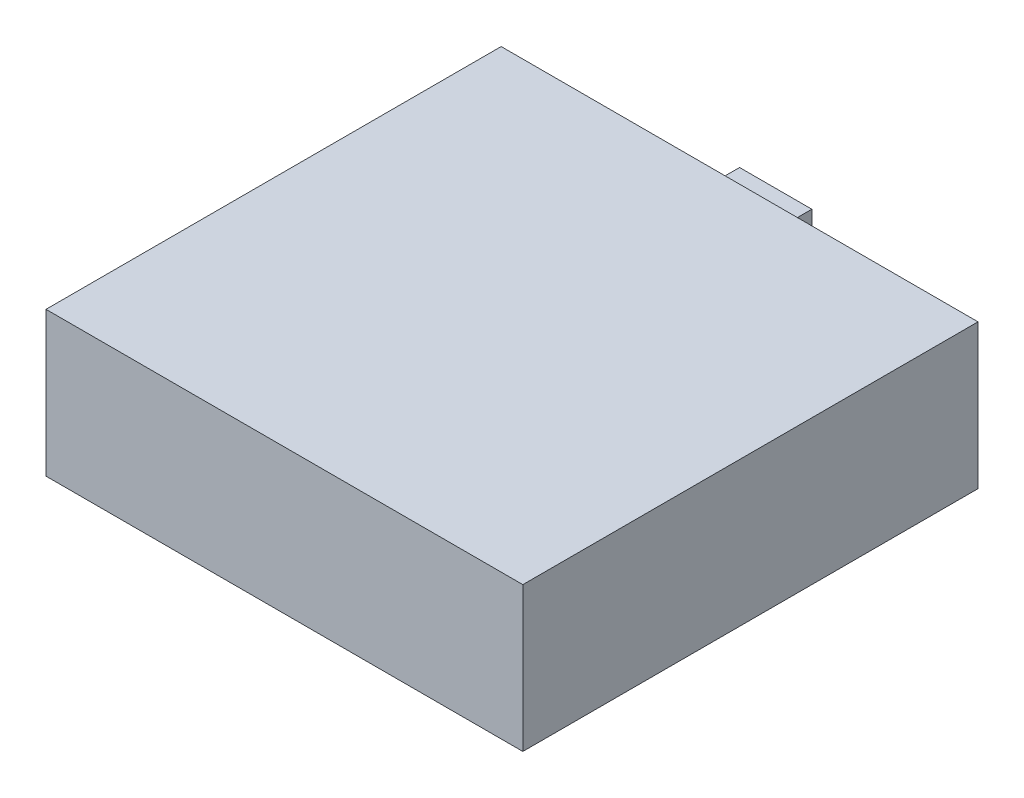
ISO-10303-21;
HEADER;
FILE_DESCRIPTION(('STEP AP214'),'2;1');
FILE_NAME('part.step','',(''),(''),'','','');
FILE_SCHEMA(('AUTOMOTIVE_DESIGN { 1 0 10303 214 1 1 1 1 }'));
ENDSEC;
DATA;
#1=APPLICATION_CONTEXT('core data for automotive mechanical design processes');
#2=APPLICATION_PROTOCOL_DEFINITION('international standard','automotive_design',2000,#1);
#3=PRODUCT_CONTEXT('',#1,'mechanical');
#4=PRODUCT('Part','Part','',(#3));
#5=PRODUCT_RELATED_PRODUCT_CATEGORY('part','',(#4));
#6=PRODUCT_DEFINITION_FORMATION('','',#4);
#7=PRODUCT_DEFINITION_CONTEXT('part definition',#1,'design');
#8=PRODUCT_DEFINITION('design','',#6,#7);
#9=PRODUCT_DEFINITION_SHAPE('','',#8);
#10=(LENGTH_UNIT() NAMED_UNIT(*) SI_UNIT(.MILLI.,.METRE.));
#11=(NAMED_UNIT(*) PLANE_ANGLE_UNIT() SI_UNIT($,.RADIAN.));
#12=(NAMED_UNIT(*) SI_UNIT($,.STERADIAN.) SOLID_ANGLE_UNIT());
#13=UNCERTAINTY_MEASURE_WITH_UNIT(LENGTH_MEASURE(1.E-05),#10,'distance_accuracy_value','');
#14=(GEOMETRIC_REPRESENTATION_CONTEXT(3) GLOBAL_UNCERTAINTY_ASSIGNED_CONTEXT((#13)) GLOBAL_UNIT_ASSIGNED_CONTEXT((#10,
#11,#12)) REPRESENTATION_CONTEXT('',''));
#15=CARTESIAN_POINT('',(0.,0.,0.));
#16=DIRECTION('',(0.,0.,1.));
#17=DIRECTION('',(1.,0.,0.));
#18=AXIS2_PLACEMENT_3D('',#15,#16,#17);
#19=CARTESIAN_POINT('',(-33.,20.,-31.5));
#20=DIRECTION('',(0.,0.,1.));
#21=DIRECTION('',(1.,0.,0.));
#22=AXIS2_PLACEMENT_3D('',#19,#20,#21);
#23=PLANE('',#22);
#24=DIRECTION('',(-1.,0.,0.));
#25=VECTOR('',#24,1.);
#26=CARTESIAN_POINT('',(-33.,0.,-31.5));
#27=LINE('',#26,#25);
#28=CARTESIAN_POINT('',(33.,0.,-31.5));
#29=VERTEX_POINT('',#28);
#30=CARTESIAN_POINT('',(-33.,0.,-31.5));
#31=VERTEX_POINT('',#30);
#32=EDGE_CURVE('E144',#29,#31,#27,.T.);
#33=ORIENTED_EDGE('',*,*,#32,.T.);
#34=DIRECTION('',(0.,-1.,0.));
#35=VECTOR('',#34,1.);
#36=CARTESIAN_POINT('',(-33.,20.,-31.5));
#37=LINE('',#36,#35);
#38=CARTESIAN_POINT('',(-33.,20.,-31.5));
#39=VERTEX_POINT('',#38);
#40=EDGE_CURVE('E58',#39,#31,#37,.T.);
#41=ORIENTED_EDGE('',*,*,#40,.F.);
#42=DIRECTION('',(-1.,0.,0.));
#43=VECTOR('',#42,1.);
#44=CARTESIAN_POINT('',(-33.,20.,-31.5));
#45=LINE('',#44,#43);
#46=CARTESIAN_POINT('',(33.,20.,-31.5));
#47=VERTEX_POINT('',#46);
#48=EDGE_CURVE('E154',#47,#39,#45,.T.);
#49=ORIENTED_EDGE('',*,*,#48,.F.);
#50=DIRECTION('',(0.,-1.,0.));
#51=VECTOR('',#50,1.);
#52=CARTESIAN_POINT('',(33.,20.,-31.5));
#53=LINE('',#52,#51);
#54=EDGE_CURVE('E11',#47,#29,#53,.T.);
#55=ORIENTED_EDGE('',*,*,#54,.T.);
#56=EDGE_LOOP('',(#33,#41,#49,#55));
#57=FACE_BOUND('',#56,.T.);
#58=DIRECTION('',(0.,1.,0.));
#59=VECTOR('',#58,1.);
#60=CARTESIAN_POINT('',(-5.,17.,-31.5));
#61=LINE('',#60,#59);
#62=CARTESIAN_POINT('',(-5.,13.,-31.5));
#63=VERTEX_POINT('',#62);
#64=CARTESIAN_POINT('',(-4.99999999999999,17.,-31.5));
#65=VERTEX_POINT('',#64);
#66=EDGE_CURVE('E137',#63,#65,#61,.T.);
#67=ORIENTED_EDGE('',*,*,#66,.F.);
#68=DIRECTION('',(-1.,0.,0.));
#69=VECTOR('',#68,1.);
#70=CARTESIAN_POINT('',(5.,13.,-31.5));
#71=LINE('',#70,#69);
#72=CARTESIAN_POINT('',(5.,13.,-31.5));
#73=VERTEX_POINT('',#72);
#74=EDGE_CURVE('E134',#73,#63,#71,.T.);
#75=ORIENTED_EDGE('',*,*,#74,.F.);
#76=DIRECTION('',(0.,-1.,0.));
#77=VECTOR('',#76,1.);
#78=CARTESIAN_POINT('',(5.,17.,-31.5));
#79=LINE('',#78,#77);
#80=CARTESIAN_POINT('',(5.,17.,-31.5));
#81=VERTEX_POINT('',#80);
#82=EDGE_CURVE('E70',#81,#73,#79,.T.);
#83=ORIENTED_EDGE('',*,*,#82,.F.);
#84=DIRECTION('',(1.,0.,0.));
#85=VECTOR('',#84,1.);
#86=CARTESIAN_POINT('',(5.,17.,-31.5));
#87=LINE('',#86,#85);
#88=EDGE_CURVE('E65',#65,#81,#87,.T.);
#89=ORIENTED_EDGE('',*,*,#88,.F.);
#90=EDGE_LOOP('',(#67,#75,#83,#89));
#91=FACE_BOUND('',#90,.T.);
#92=ADVANCED_FACE('F49',(#57,#91),#23,.F.);
#93=CARTESIAN_POINT('',(33.,20.,-31.5));
#94=DIRECTION('',(-1.,0.,0.));
#95=DIRECTION('',(0.,0.,1.));
#96=AXIS2_PLACEMENT_3D('',#93,#94,#95);
#97=PLANE('',#96);
#98=DIRECTION('',(0.,0.,-1.));
#99=VECTOR('',#98,1.);
#100=CARTESIAN_POINT('',(33.,0.,-31.5));
#101=LINE('',#100,#99);
#102=CARTESIAN_POINT('',(33.,0.,31.5));
#103=VERTEX_POINT('',#102);
#104=EDGE_CURVE('E139',#103,#29,#101,.T.);
#105=ORIENTED_EDGE('',*,*,#104,.T.);
#106=ORIENTED_EDGE('',*,*,#54,.F.);
#107=DIRECTION('',(0.,0.,-1.));
#108=VECTOR('',#107,1.);
#109=CARTESIAN_POINT('',(33.,20.,-31.5));
#110=LINE('',#109,#108);
#111=CARTESIAN_POINT('',(33.,20.,31.5));
#112=VERTEX_POINT('',#111);
#113=EDGE_CURVE('E150',#112,#47,#110,.T.);
#114=ORIENTED_EDGE('',*,*,#113,.F.);
#115=DIRECTION('',(0.,-1.,0.));
#116=VECTOR('',#115,1.);
#117=CARTESIAN_POINT('',(33.,20.,31.5));
#118=LINE('',#117,#116);
#119=EDGE_CURVE('E163',#112,#103,#118,.T.);
#120=ORIENTED_EDGE('',*,*,#119,.T.);
#121=EDGE_LOOP('',(#105,#106,#114,#120));
#122=FACE_BOUND('',#121,.T.);
#123=ADVANCED_FACE('F51',(#122),#97,.F.);
#124=CARTESIAN_POINT('',(-33.,20.,-31.5));
#125=DIRECTION('',(1.,0.,0.));
#126=DIRECTION('',(0.,0.,-1.));
#127=AXIS2_PLACEMENT_3D('',#124,#125,#126);
#128=PLANE('',#127);
#129=DIRECTION('',(0.,0.,1.));
#130=VECTOR('',#129,1.);
#131=CARTESIAN_POINT('',(-33.,0.,-31.5));
#132=LINE('',#131,#130);
#133=CARTESIAN_POINT('',(-33.,0.,31.5));
#134=VERTEX_POINT('',#133);
#135=EDGE_CURVE('E167',#31,#134,#132,.T.);
#136=ORIENTED_EDGE('',*,*,#135,.T.);
#137=DIRECTION('',(0.,-1.,0.));
#138=VECTOR('',#137,1.);
#139=CARTESIAN_POINT('',(-33.,20.,31.5));
#140=LINE('',#139,#138);
#141=CARTESIAN_POINT('',(-33.,20.,31.5));
#142=VERTEX_POINT('',#141);
#143=EDGE_CURVE('E175',#142,#134,#140,.T.);
#144=ORIENTED_EDGE('',*,*,#143,.F.);
#145=DIRECTION('',(0.,0.,1.));
#146=VECTOR('',#145,1.);
#147=CARTESIAN_POINT('',(-33.,20.,-31.5));
#148=LINE('',#147,#146);
#149=EDGE_CURVE('E158',#39,#142,#148,.T.);
#150=ORIENTED_EDGE('',*,*,#149,.F.);
#151=ORIENTED_EDGE('',*,*,#40,.T.);
#152=EDGE_LOOP('',(#136,#144,#150,#151));
#153=FACE_BOUND('',#152,.T.);
#154=ADVANCED_FACE('F184',(#153),#128,.F.);
#155=CARTESIAN_POINT('',(-33.,20.,31.5));
#156=DIRECTION('',(0.,0.,-1.));
#157=DIRECTION('',(-1.,0.,0.));
#158=AXIS2_PLACEMENT_3D('',#155,#156,#157);
#159=PLANE('',#158);
#160=DIRECTION('',(1.,0.,0.));
#161=VECTOR('',#160,1.);
#162=CARTESIAN_POINT('',(-33.,0.,31.5));
#163=LINE('',#162,#161);
#164=EDGE_CURVE('E155',#134,#103,#163,.T.);
#165=ORIENTED_EDGE('',*,*,#164,.T.);
#166=ORIENTED_EDGE('',*,*,#119,.F.);
#167=DIRECTION('',(1.,0.,0.));
#168=VECTOR('',#167,1.);
#169=CARTESIAN_POINT('',(-33.,20.,31.5));
#170=LINE('',#169,#168);
#171=EDGE_CURVE('E161',#142,#112,#170,.T.);
#172=ORIENTED_EDGE('',*,*,#171,.F.);
#173=ORIENTED_EDGE('',*,*,#143,.T.);
#174=EDGE_LOOP('',(#165,#166,#172,#173));
#175=FACE_BOUND('',#174,.T.);
#176=ADVANCED_FACE('F193',(#175),#159,.F.);
#177=CARTESIAN_POINT('',(0.,20.,0.));
#178=DIRECTION('',(0.,1.,0.));
#179=DIRECTION('',(0.,0.,1.));
#180=AXIS2_PLACEMENT_3D('',#177,#178,#179);
#181=PLANE('',#180);
#182=ORIENTED_EDGE('',*,*,#113,.T.);
#183=ORIENTED_EDGE('',*,*,#48,.T.);
#184=ORIENTED_EDGE('',*,*,#149,.T.);
#185=ORIENTED_EDGE('',*,*,#171,.T.);
#186=EDGE_LOOP('',(#182,#183,#184,#185));
#187=FACE_BOUND('',#186,.T.);
#188=ADVANCED_FACE('F199',(#187),#181,.T.);
#189=CARTESIAN_POINT('',(0.,0.,0.));
#190=DIRECTION('',(0.,1.,0.));
#191=DIRECTION('',(0.,0.,1.));
#192=AXIS2_PLACEMENT_3D('',#189,#190,#191);
#193=PLANE('',#192);
#194=ORIENTED_EDGE('',*,*,#104,.F.);
#195=ORIENTED_EDGE('',*,*,#164,.F.);
#196=ORIENTED_EDGE('',*,*,#135,.F.);
#197=ORIENTED_EDGE('',*,*,#32,.F.);
#198=EDGE_LOOP('',(#194,#195,#196,#197));
#199=FACE_BOUND('',#198,.T.);
#200=ADVANCED_FACE('F190',(#199),#193,.F.);
#201=CARTESIAN_POINT('',(-5.,17.,-36.5));
#202=DIRECTION('',(1.,0.,0.));
#203=DIRECTION('',(0.,1.,0.));
#204=AXIS2_PLACEMENT_3D('',#201,#202,#203);
#205=PLANE('',#204);
#206=ORIENTED_EDGE('',*,*,#66,.T.);
#207=DIRECTION('',(0.,0.,1.));
#208=VECTOR('',#207,1.);
#209=CARTESIAN_POINT('',(-5.,17.,-36.5));
#210=LINE('',#209,#208);
#211=CARTESIAN_POINT('',(-5.,17.,-36.5));
#212=VERTEX_POINT('',#211);
#213=EDGE_CURVE('E116',#212,#65,#210,.T.);
#214=ORIENTED_EDGE('',*,*,#213,.F.);
#215=DIRECTION('',(0.,1.,0.));
#216=VECTOR('',#215,1.);
#217=CARTESIAN_POINT('',(-5.,17.,-36.5));
#218=LINE('',#217,#216);
#219=CARTESIAN_POINT('',(-5.,13.,-36.5));
#220=VERTEX_POINT('',#219);
#221=EDGE_CURVE('E124',#220,#212,#218,.T.);
#222=ORIENTED_EDGE('',*,*,#221,.F.);
#223=DIRECTION('',(0.,0.,1.));
#224=VECTOR('',#223,1.);
#225=CARTESIAN_POINT('',(-5.,13.,-36.5));
#226=LINE('',#225,#224);
#227=EDGE_CURVE('E207',#220,#63,#226,.T.);
#228=ORIENTED_EDGE('',*,*,#227,.T.);
#229=EDGE_LOOP('',(#206,#214,#222,#228));
#230=FACE_BOUND('',#229,.T.);
#231=ADVANCED_FACE('F136',(#230),#205,.F.);
#232=CARTESIAN_POINT('',(5.,17.,-36.5));
#233=DIRECTION('',(0.,-1.,0.));
#234=DIRECTION('',(0.,0.,-1.));
#235=AXIS2_PLACEMENT_3D('',#232,#233,#234);
#236=PLANE('',#235);
#237=ORIENTED_EDGE('',*,*,#88,.T.);
#238=DIRECTION('',(0.,0.,1.));
#239=VECTOR('',#238,1.);
#240=CARTESIAN_POINT('',(5.,17.,-36.5));
#241=LINE('',#240,#239);
#242=CARTESIAN_POINT('',(5.,17.,-36.5));
#243=VERTEX_POINT('',#242);
#244=EDGE_CURVE('E119',#243,#81,#241,.T.);
#245=ORIENTED_EDGE('',*,*,#244,.F.);
#246=DIRECTION('',(1.,0.,0.));
#247=VECTOR('',#246,1.);
#248=CARTESIAN_POINT('',(5.,17.,-36.5));
#249=LINE('',#248,#247);
#250=EDGE_CURVE('E112',#212,#243,#249,.T.);
#251=ORIENTED_EDGE('',*,*,#250,.F.);
#252=ORIENTED_EDGE('',*,*,#213,.T.);
#253=EDGE_LOOP('',(#237,#245,#251,#252));
#254=FACE_BOUND('',#253,.T.);
#255=ADVANCED_FACE('F114',(#254),#236,.F.);
#256=CARTESIAN_POINT('',(5.,17.,-36.5));
#257=DIRECTION('',(-1.,0.,0.));
#258=DIRECTION('',(0.,-1.,0.));
#259=AXIS2_PLACEMENT_3D('',#256,#257,#258);
#260=PLANE('',#259);
#261=ORIENTED_EDGE('',*,*,#82,.T.);
#262=DIRECTION('',(0.,0.,1.));
#263=VECTOR('',#262,1.);
#264=CARTESIAN_POINT('',(5.,13.,-36.5));
#265=LINE('',#264,#263);
#266=CARTESIAN_POINT('',(5.,13.,-36.5));
#267=VERTEX_POINT('',#266);
#268=EDGE_CURVE('E146',#267,#73,#265,.T.);
#269=ORIENTED_EDGE('',*,*,#268,.F.);
#270=DIRECTION('',(0.,-1.,0.));
#271=VECTOR('',#270,1.);
#272=CARTESIAN_POINT('',(5.,17.,-36.5));
#273=LINE('',#272,#271);
#274=EDGE_CURVE('E123',#243,#267,#273,.T.);
#275=ORIENTED_EDGE('',*,*,#274,.F.);
#276=ORIENTED_EDGE('',*,*,#244,.T.);
#277=EDGE_LOOP('',(#261,#269,#275,#276));
#278=FACE_BOUND('',#277,.T.);
#279=ADVANCED_FACE('F223',(#278),#260,.F.);
#280=CARTESIAN_POINT('',(5.,13.,-36.5));
#281=DIRECTION('',(0.,1.,0.));
#282=DIRECTION('',(0.,0.,1.));
#283=AXIS2_PLACEMENT_3D('',#280,#281,#282);
#284=PLANE('',#283);
#285=ORIENTED_EDGE('',*,*,#74,.T.);
#286=ORIENTED_EDGE('',*,*,#227,.F.);
#287=DIRECTION('',(-1.,0.,0.));
#288=VECTOR('',#287,1.);
#289=CARTESIAN_POINT('',(5.,13.,-36.5));
#290=LINE('',#289,#288);
#291=EDGE_CURVE('E129',#267,#220,#290,.T.);
#292=ORIENTED_EDGE('',*,*,#291,.F.);
#293=ORIENTED_EDGE('',*,*,#268,.T.);
#294=EDGE_LOOP('',(#285,#286,#292,#293));
#295=FACE_BOUND('',#294,.T.);
#296=ADVANCED_FACE('F206',(#295),#284,.F.);
#297=CARTESIAN_POINT('',(0.,0.,-36.5));
#298=DIRECTION('',(0.,0.,-1.));
#299=DIRECTION('',(-1.,0.,0.));
#300=AXIS2_PLACEMENT_3D('',#297,#298,#299);
#301=PLANE('',#300);
#302=ORIENTED_EDGE('',*,*,#221,.T.);
#303=ORIENTED_EDGE('',*,*,#250,.T.);
#304=ORIENTED_EDGE('',*,*,#274,.T.);
#305=ORIENTED_EDGE('',*,*,#291,.T.);
#306=EDGE_LOOP('',(#302,#303,#304,#305));
#307=FACE_BOUND('',#306,.T.);
#308=ADVANCED_FACE('F127',(#307),#301,.T.);
#309=CLOSED_SHELL('',(#92,#123,#154,#176,#188,#200,#231,#255,#279,#296,#308));
#310=MANIFOLD_SOLID_BREP('B2',#309);
#311=ADVANCED_BREP_SHAPE_REPRESENTATION('',(#18,#310),#14);
#312=SHAPE_DEFINITION_REPRESENTATION(#9,#311);
ENDSEC;
END-ISO-10303-21;
